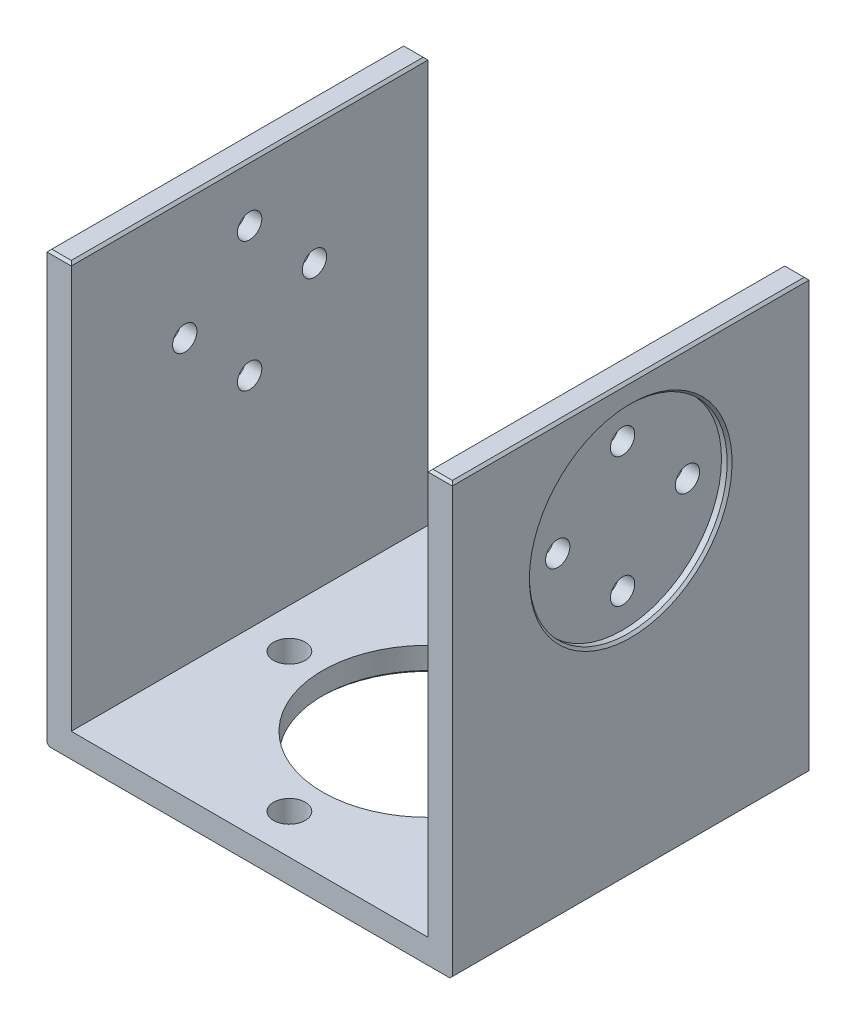
ISO-10303-21;
HEADER;
FILE_DESCRIPTION(('STEP AP214'),'2;1');
FILE_NAME('part.step','',(''),(''),'','','');
FILE_SCHEMA(('AUTOMOTIVE_DESIGN { 1 0 10303 214 1 1 1 1 }'));
ENDSEC;
DATA;
#1=APPLICATION_CONTEXT('core data for automotive mechanical design processes');
#2=APPLICATION_PROTOCOL_DEFINITION('international standard','automotive_design',2000,#1);
#3=PRODUCT_CONTEXT('',#1,'mechanical');
#4=PRODUCT('Part','Part','',(#3));
#5=PRODUCT_RELATED_PRODUCT_CATEGORY('part','',(#4));
#6=PRODUCT_DEFINITION_FORMATION('','',#4);
#7=PRODUCT_DEFINITION_CONTEXT('part definition',#1,'design');
#8=PRODUCT_DEFINITION('design','',#6,#7);
#9=PRODUCT_DEFINITION_SHAPE('','',#8);
#10=(LENGTH_UNIT() NAMED_UNIT(*) SI_UNIT(.MILLI.,.METRE.));
#11=(NAMED_UNIT(*) PLANE_ANGLE_UNIT() SI_UNIT($,.RADIAN.));
#12=(NAMED_UNIT(*) SI_UNIT($,.STERADIAN.) SOLID_ANGLE_UNIT());
#13=UNCERTAINTY_MEASURE_WITH_UNIT(LENGTH_MEASURE(1.E-05),#10,'distance_accuracy_value','');
#14=(GEOMETRIC_REPRESENTATION_CONTEXT(3) GLOBAL_UNCERTAINTY_ASSIGNED_CONTEXT((#13)) GLOBAL_UNIT_ASSIGNED_CONTEXT((#10,
#11,#12)) REPRESENTATION_CONTEXT('',''));
#15=CARTESIAN_POINT('',(0.,0.,0.));
#16=DIRECTION('',(0.,0.,1.));
#17=DIRECTION('',(1.,0.,0.));
#18=AXIS2_PLACEMENT_3D('',#15,#16,#17);
#19=CARTESIAN_POINT('',(25.,38.,-7.99999999999989));
#20=DIRECTION('',(-1.,0.,0.));
#21=DIRECTION('',(0.,0.,1.));
#22=AXIS2_PLACEMENT_3D('',#19,#20,#21);
#23=CYLINDRICAL_SURFACE('',#22,1.50000000000001);
#24=CARTESIAN_POINT('',(-22.,38.,-7.99999999999989));
#25=DIRECTION('',(-1.,0.,0.));
#26=DIRECTION('',(0.,0.,1.));
#27=AXIS2_PLACEMENT_3D('',#24,#25,#26);
#28=CIRCLE('',#27,1.50000000000001);
#29=CARTESIAN_POINT('',(-22.,38.,-6.49999999999988));
#30=VERTEX_POINT('',#29);
#31=EDGE_CURVE('E231',#30,#30,#28,.T.);
#32=ORIENTED_EDGE('',*,*,#31,.F.);
#33=EDGE_LOOP('',(#32));
#34=FACE_BOUND('',#33,.T.);
#35=CARTESIAN_POINT('',(-24.,38.,-7.99999999999989));
#36=DIRECTION('',(-1.,0.,0.));
#37=DIRECTION('',(0.,0.,1.));
#38=AXIS2_PLACEMENT_3D('',#35,#36,#37);
#39=CIRCLE('',#38,1.50000000000001);
#40=CARTESIAN_POINT('',(-24.,38.,-6.49999999999988));
#41=VERTEX_POINT('',#40);
#42=EDGE_CURVE('E452',#41,#41,#39,.F.);
#43=ORIENTED_EDGE('',*,*,#42,.F.);
#44=EDGE_LOOP('',(#43));
#45=FACE_BOUND('',#44,.T.);
#46=ADVANCED_FACE('F37',(#34,#45),#23,.F.);
#47=CARTESIAN_POINT('',(25.,30.,1.65619827587224E-13));
#48=DIRECTION('',(-1.,0.,0.));
#49=DIRECTION('',(0.,0.,1.));
#50=AXIS2_PLACEMENT_3D('',#47,#48,#49);
#51=CYLINDRICAL_SURFACE('',#50,1.5);
#52=CARTESIAN_POINT('',(-22.,30.,1.69325827740447E-13));
#53=DIRECTION('',(-1.,0.,0.));
#54=DIRECTION('',(0.,0.,1.));
#55=AXIS2_PLACEMENT_3D('',#52,#53,#54);
#56=CIRCLE('',#55,1.5);
#57=CARTESIAN_POINT('',(-22.,30.,1.50000000000017));
#58=VERTEX_POINT('',#57);
#59=EDGE_CURVE('E236',#58,#58,#56,.T.);
#60=ORIENTED_EDGE('',*,*,#59,.F.);
#61=EDGE_LOOP('',(#60));
#62=FACE_BOUND('',#61,.T.);
#63=CARTESIAN_POINT('',(-24.,30.,1.69483529874627E-13));
#64=DIRECTION('',(-1.,0.,0.));
#65=DIRECTION('',(0.,0.,1.));
#66=AXIS2_PLACEMENT_3D('',#63,#64,#65);
#67=CIRCLE('',#66,1.5);
#68=CARTESIAN_POINT('',(-24.,30.,1.50000000000017));
#69=VERTEX_POINT('',#68);
#70=EDGE_CURVE('E449',#69,#69,#67,.F.);
#71=ORIENTED_EDGE('',*,*,#70,.F.);
#72=EDGE_LOOP('',(#71));
#73=FACE_BOUND('',#72,.T.);
#74=ADVANCED_FACE('F400',(#62,#73),#51,.F.);
#75=CARTESIAN_POINT('',(25.,38.0000000000001,8.00000000000011));
#76=DIRECTION('',(-1.,0.,0.));
#77=DIRECTION('',(0.,0.,1.));
#78=AXIS2_PLACEMENT_3D('',#75,#76,#77);
#79=CYLINDRICAL_SURFACE('',#78,1.5);
#80=CARTESIAN_POINT('',(-22.,38.0000000000001,8.00000000000011));
#81=DIRECTION('',(-1.,0.,0.));
#82=DIRECTION('',(0.,0.,1.));
#83=AXIS2_PLACEMENT_3D('',#80,#81,#82);
#84=CIRCLE('',#83,1.5);
#85=CARTESIAN_POINT('',(-22.,38.0000000000001,9.50000000000012));
#86=VERTEX_POINT('',#85);
#87=EDGE_CURVE('E240',#86,#86,#84,.T.);
#88=ORIENTED_EDGE('',*,*,#87,.F.);
#89=EDGE_LOOP('',(#88));
#90=FACE_BOUND('',#89,.T.);
#91=CARTESIAN_POINT('',(-24.,38.0000000000001,8.00000000000011));
#92=DIRECTION('',(-1.,0.,0.));
#93=DIRECTION('',(0.,0.,1.));
#94=AXIS2_PLACEMENT_3D('',#91,#92,#93);
#95=CIRCLE('',#94,1.5);
#96=CARTESIAN_POINT('',(-24.,38.0000000000001,9.50000000000012));
#97=VERTEX_POINT('',#96);
#98=EDGE_CURVE('E251',#97,#97,#95,.F.);
#99=ORIENTED_EDGE('',*,*,#98,.F.);
#100=EDGE_LOOP('',(#99));
#101=FACE_BOUND('',#100,.T.);
#102=ADVANCED_FACE('F406',(#90,#101),#79,.F.);
#103=CARTESIAN_POINT('',(25.,46.,0.));
#104=DIRECTION('',(-1.,0.,0.));
#105=DIRECTION('',(0.,0.,1.));
#106=AXIS2_PLACEMENT_3D('',#103,#104,#105);
#107=CYLINDRICAL_SURFACE('',#106,1.5);
#108=CARTESIAN_POINT('',(-22.,46.,0.));
#109=DIRECTION('',(-1.,0.,0.));
#110=DIRECTION('',(0.,0.,1.));
#111=AXIS2_PLACEMENT_3D('',#108,#109,#110);
#112=CIRCLE('',#111,1.5);
#113=CARTESIAN_POINT('',(-22.,46.,1.5));
#114=VERTEX_POINT('',#113);
#115=EDGE_CURVE('E170',#114,#114,#112,.T.);
#116=ORIENTED_EDGE('',*,*,#115,.F.);
#117=EDGE_LOOP('',(#116));
#118=FACE_BOUND('',#117,.T.);
#119=CARTESIAN_POINT('',(-24.,46.,0.));
#120=DIRECTION('',(-1.,0.,0.));
#121=DIRECTION('',(0.,0.,1.));
#122=AXIS2_PLACEMENT_3D('',#119,#120,#121);
#123=CIRCLE('',#122,1.5);
#124=CARTESIAN_POINT('',(-24.,46.,1.5));
#125=VERTEX_POINT('',#124);
#126=EDGE_CURVE('E248',#125,#125,#123,.F.);
#127=ORIENTED_EDGE('',*,*,#126,.F.);
#128=EDGE_LOOP('',(#127));
#129=FACE_BOUND('',#128,.T.);
#130=ADVANCED_FACE('F413',(#118,#129),#107,.F.);
#131=CARTESIAN_POINT('',(22.,38.,-7.99999999999989));
#132=DIRECTION('',(1.,0.,0.));
#133=DIRECTION('',(0.,0.,-1.));
#134=AXIS2_PLACEMENT_3D('',#131,#132,#133);
#135=CIRCLE('',#134,1.50000000000001);
#136=CARTESIAN_POINT('',(22.,38.,-9.4999999999999));
#137=VERTEX_POINT('',#136);
#138=EDGE_CURVE('E228',#137,#137,#135,.T.);
#139=ORIENTED_EDGE('',*,*,#138,.F.);
#140=EDGE_LOOP('',(#139));
#141=FACE_BOUND('',#140,.T.);
#142=CARTESIAN_POINT('',(24.,38.,-7.99999999999989));
#143=DIRECTION('',(1.,0.,0.));
#144=DIRECTION('',(0.,0.,-1.));
#145=AXIS2_PLACEMENT_3D('',#142,#143,#144);
#146=CIRCLE('',#145,1.50000000000001);
#147=CARTESIAN_POINT('',(24.,38.,-9.4999999999999));
#148=VERTEX_POINT('',#147);
#149=EDGE_CURVE('E232',#148,#148,#146,.F.);
#150=ORIENTED_EDGE('',*,*,#149,.F.);
#151=EDGE_LOOP('',(#150));
#152=FACE_BOUND('',#151,.T.);
#153=ADVANCED_FACE('F402',(#141,#152),#23,.F.);
#154=CARTESIAN_POINT('',(22.,30.,1.65856380788494E-13));
#155=DIRECTION('',(1.,0.,0.));
#156=DIRECTION('',(0.,0.,-1.));
#157=AXIS2_PLACEMENT_3D('',#154,#155,#156);
#158=CIRCLE('',#157,1.5);
#159=CARTESIAN_POINT('',(22.,30.,-1.49999999999984));
#160=VERTEX_POINT('',#159);
#161=EDGE_CURVE('E233',#160,#160,#158,.T.);
#162=ORIENTED_EDGE('',*,*,#161,.F.);
#163=EDGE_LOOP('',(#162));
#164=FACE_BOUND('',#163,.T.);
#165=CARTESIAN_POINT('',(24.,30.,1.65698678654314E-13));
#166=DIRECTION('',(1.,0.,0.));
#167=DIRECTION('',(0.,0.,-1.));
#168=AXIS2_PLACEMENT_3D('',#165,#166,#167);
#169=CIRCLE('',#168,1.5);
#170=CARTESIAN_POINT('',(24.,30.,-1.49999999999984));
#171=VERTEX_POINT('',#170);
#172=EDGE_CURVE('E429',#171,#171,#169,.F.);
#173=ORIENTED_EDGE('',*,*,#172,.F.);
#174=EDGE_LOOP('',(#173));
#175=FACE_BOUND('',#174,.T.);
#176=ADVANCED_FACE('F409',(#164,#175),#51,.F.);
#177=CARTESIAN_POINT('',(22.,38.0000000000001,8.00000000000011));
#178=DIRECTION('',(1.,0.,0.));
#179=DIRECTION('',(0.,0.,-1.));
#180=AXIS2_PLACEMENT_3D('',#177,#178,#179);
#181=CIRCLE('',#180,1.5);
#182=CARTESIAN_POINT('',(22.,38.0000000000001,6.50000000000011));
#183=VERTEX_POINT('',#182);
#184=EDGE_CURVE('E237',#183,#183,#181,.T.);
#185=ORIENTED_EDGE('',*,*,#184,.F.);
#186=EDGE_LOOP('',(#185));
#187=FACE_BOUND('',#186,.T.);
#188=CARTESIAN_POINT('',(24.,38.0000000000001,8.00000000000011));
#189=DIRECTION('',(1.,0.,0.));
#190=DIRECTION('',(0.,0.,-1.));
#191=AXIS2_PLACEMENT_3D('',#188,#189,#190);
#192=CIRCLE('',#191,1.5);
#193=CARTESIAN_POINT('',(24.,38.0000000000001,6.50000000000011));
#194=VERTEX_POINT('',#193);
#195=EDGE_CURVE('E246',#194,#194,#192,.F.);
#196=ORIENTED_EDGE('',*,*,#195,.F.);
#197=EDGE_LOOP('',(#196));
#198=FACE_BOUND('',#197,.T.);
#199=ADVANCED_FACE('F419',(#187,#198),#79,.F.);
#200=CARTESIAN_POINT('',(22.,46.,0.));
#201=DIRECTION('',(1.,0.,0.));
#202=DIRECTION('',(0.,0.,-1.));
#203=AXIS2_PLACEMENT_3D('',#200,#201,#202);
#204=CIRCLE('',#203,1.5);
#205=CARTESIAN_POINT('',(22.,46.,-1.5));
#206=VERTEX_POINT('',#205);
#207=EDGE_CURVE('E174',#206,#206,#204,.T.);
#208=ORIENTED_EDGE('',*,*,#207,.F.);
#209=EDGE_LOOP('',(#208));
#210=FACE_BOUND('',#209,.T.);
#211=CARTESIAN_POINT('',(24.,46.,0.));
#212=DIRECTION('',(1.,0.,0.));
#213=DIRECTION('',(0.,0.,-1.));
#214=AXIS2_PLACEMENT_3D('',#211,#212,#213);
#215=CIRCLE('',#214,1.5);
#216=CARTESIAN_POINT('',(24.,46.,-1.5));
#217=VERTEX_POINT('',#216);
#218=EDGE_CURVE('E243',#217,#217,#215,.F.);
#219=ORIENTED_EDGE('',*,*,#218,.F.);
#220=EDGE_LOOP('',(#219));
#221=FACE_BOUND('',#220,.T.);
#222=ADVANCED_FACE('F423',(#210,#221),#107,.F.);
#223=CARTESIAN_POINT('',(0.,3.,0.));
#224=DIRECTION('',(0.,1.,0.));
#225=DIRECTION('',(0.,0.,1.));
#226=AXIS2_PLACEMENT_3D('',#223,#224,#225);
#227=PLANE('',#226);
#228=CARTESIAN_POINT('',(-17.0960910327302,3.,4.84853298069949E-13));
#229=DIRECTION('',(0.,1.,0.));
#230=DIRECTION('',(0.,0.,1.));
#231=AXIS2_PLACEMENT_3D('',#228,#229,#230);
#232=CIRCLE('',#231,1.95383897516999);
#233=CARTESIAN_POINT('',(-17.0960910327302,3.,1.95383897517048));
#234=VERTEX_POINT('',#233);
#235=EDGE_CURVE('E186',#234,#234,#232,.T.);
#236=ORIENTED_EDGE('',*,*,#235,.F.);
#237=EDGE_LOOP('',(#236));
#238=FACE_BOUND('',#237,.T.);
#239=CARTESIAN_POINT('',(17.0960910327312,3.,-4.82759630753832E-13));
#240=DIRECTION('',(0.,1.,0.));
#241=DIRECTION('',(0.,0.,1.));
#242=AXIS2_PLACEMENT_3D('',#239,#240,#241);
#243=CIRCLE('',#242,1.9538389751696);
#244=CARTESIAN_POINT('',(17.0960910327312,3.,1.95383897516911));
#245=VERTEX_POINT('',#244);
#246=EDGE_CURVE('E198',#245,#245,#243,.T.);
#247=ORIENTED_EDGE('',*,*,#246,.F.);
#248=EDGE_LOOP('',(#247));
#249=FACE_BOUND('',#248,.T.);
#250=CARTESIAN_POINT('',(0.,3.,-17.0960910327307));
#251=DIRECTION('',(0.,1.,0.));
#252=DIRECTION('',(0.,0.,1.));
#253=AXIS2_PLACEMENT_3D('',#250,#251,#252);
#254=CIRCLE('',#253,1.95383897516922);
#255=CARTESIAN_POINT('',(0.,3.,-15.1422520575615));
#256=VERTEX_POINT('',#255);
#257=EDGE_CURVE('E204',#256,#256,#254,.T.);
#258=ORIENTED_EDGE('',*,*,#257,.F.);
#259=EDGE_LOOP('',(#258));
#260=FACE_BOUND('',#259,.T.);
#261=CARTESIAN_POINT('',(9.65519261507664E-13,3.,17.0960910327307));
#262=DIRECTION('',(0.,1.,0.));
#263=DIRECTION('',(0.,0.,1.));
#264=AXIS2_PLACEMENT_3D('',#261,#262,#263);
#265=CIRCLE('',#264,1.95383897517026);
#266=CARTESIAN_POINT('',(9.65519261507664E-13,3.,19.0499300079009));
#267=VERTEX_POINT('',#266);
#268=EDGE_CURVE('E192',#267,#267,#265,.T.);
#269=ORIENTED_EDGE('',*,*,#268,.F.);
#270=EDGE_LOOP('',(#269));
#271=FACE_BOUND('',#270,.T.);
#272=CARTESIAN_POINT('',(0.,3.,0.));
#273=DIRECTION('',(0.,1.,0.));
#274=DIRECTION('',(0.,0.,1.));
#275=AXIS2_PLACEMENT_3D('',#272,#273,#274);
#276=CIRCLE('',#275,13.);
#277=CARTESIAN_POINT('',(0.,3.,13.));
#278=VERTEX_POINT('',#277);
#279=EDGE_CURVE('E182',#278,#278,#276,.T.);
#280=ORIENTED_EDGE('',*,*,#279,.F.);
#281=EDGE_LOOP('',(#280));
#282=FACE_BOUND('',#281,.T.);
#283=DIRECTION('',(1.,0.,0.));
#284=VECTOR('',#283,1.);
#285=CARTESIAN_POINT('',(-25.,3.,22.));
#286=LINE('',#285,#284);
#287=CARTESIAN_POINT('',(-22.,3.,22.));
#288=VERTEX_POINT('',#287);
#289=CARTESIAN_POINT('',(22.,3.,22.));
#290=VERTEX_POINT('',#289);
#291=EDGE_CURVE('E165',#288,#290,#286,.T.);
#292=ORIENTED_EDGE('',*,*,#291,.T.);
#293=DIRECTION('',(0.,0.,1.));
#294=VECTOR('',#293,1.);
#295=CARTESIAN_POINT('',(22.,3.,-22.));
#296=LINE('',#295,#294);
#297=CARTESIAN_POINT('',(22.,3.,-22.));
#298=VERTEX_POINT('',#297);
#299=EDGE_CURVE('E146',#298,#290,#296,.T.);
#300=ORIENTED_EDGE('',*,*,#299,.F.);
#301=DIRECTION('',(-1.,0.,0.));
#302=VECTOR('',#301,1.);
#303=CARTESIAN_POINT('',(-25.,3.,-22.));
#304=LINE('',#303,#302);
#305=CARTESIAN_POINT('',(-22.,3.,-22.));
#306=VERTEX_POINT('',#305);
#307=EDGE_CURVE('E155',#298,#306,#304,.T.);
#308=ORIENTED_EDGE('',*,*,#307,.T.);
#309=DIRECTION('',(0.,0.,-1.));
#310=VECTOR('',#309,1.);
#311=CARTESIAN_POINT('',(-22.,3.,-22.));
#312=LINE('',#311,#310);
#313=EDGE_CURVE('E151',#288,#306,#312,.T.);
#314=ORIENTED_EDGE('',*,*,#313,.F.);
#315=EDGE_LOOP('',(#292,#300,#308,#314));
#316=FACE_BOUND('',#315,.T.);
#317=ADVANCED_FACE('F168',(#238,#249,#260,#271,#282,#316),#227,.T.);
#318=CARTESIAN_POINT('',(0.,0.,0.));
#319=DIRECTION('',(0.,1.,0.));
#320=DIRECTION('',(0.,0.,1.));
#321=AXIS2_PLACEMENT_3D('',#318,#319,#320);
#322=PLANE('',#321);
#323=CARTESIAN_POINT('',(0.,0.,0.));
#324=DIRECTION('',(0.,1.,0.));
#325=DIRECTION('',(0.,0.,1.));
#326=AXIS2_PLACEMENT_3D('',#323,#324,#325);
#327=CIRCLE('',#326,13.3);
#328=CARTESIAN_POINT('',(0.,0.,13.3));
#329=VERTEX_POINT('',#328);
#330=EDGE_CURVE('E307',#329,#329,#327,.T.);
#331=ORIENTED_EDGE('',*,*,#330,.T.);
#332=EDGE_LOOP('',(#331));
#333=FACE_BOUND('',#332,.T.);
#334=DIRECTION('',(1.,0.,0.));
#335=VECTOR('',#334,1.);
#336=CARTESIAN_POINT('',(-25.,0.,22.));
#337=LINE('',#336,#335);
#338=CARTESIAN_POINT('',(-24.7,0.,22.));
#339=VERTEX_POINT('',#338);
#340=CARTESIAN_POINT('',(24.7,0.,22.));
#341=VERTEX_POINT('',#340);
#342=EDGE_CURVE('E207',#339,#341,#337,.T.);
#343=ORIENTED_EDGE('',*,*,#342,.F.);
#344=DIRECTION('',(0.,0.,-1.));
#345=VECTOR('',#344,1.);
#346=CARTESIAN_POINT('',(-24.7,0.,0.));
#347=LINE('',#346,#345);
#348=CARTESIAN_POINT('',(-24.7,0.,-22.));
#349=VERTEX_POINT('',#348);
#350=EDGE_CURVE('E305',#339,#349,#347,.T.);
#351=ORIENTED_EDGE('',*,*,#350,.T.);
#352=DIRECTION('',(-1.,0.,0.));
#353=VECTOR('',#352,1.);
#354=CARTESIAN_POINT('',(-25.,0.,-22.));
#355=LINE('',#354,#353);
#356=CARTESIAN_POINT('',(24.7,0.,-22.));
#357=VERTEX_POINT('',#356);
#358=EDGE_CURVE('E210',#357,#349,#355,.T.);
#359=ORIENTED_EDGE('',*,*,#358,.F.);
#360=DIRECTION('',(0.,0.,1.));
#361=VECTOR('',#360,1.);
#362=CARTESIAN_POINT('',(24.7,0.,0.));
#363=LINE('',#362,#361);
#364=EDGE_CURVE('E303',#357,#341,#363,.T.);
#365=ORIENTED_EDGE('',*,*,#364,.T.);
#366=EDGE_LOOP('',(#343,#351,#359,#365));
#367=FACE_BOUND('',#366,.T.);
#368=CARTESIAN_POINT('',(0.,0.,-17.0960910327307));
#369=DIRECTION('',(0.,1.,0.));
#370=DIRECTION('',(0.,0.,1.));
#371=AXIS2_PLACEMENT_3D('',#368,#369,#370);
#372=CIRCLE('',#371,1.95383897516922);
#373=CARTESIAN_POINT('',(0.,0.,-15.1422520575615));
#374=VERTEX_POINT('',#373);
#375=EDGE_CURVE('E201',#374,#374,#372,.T.);
#376=ORIENTED_EDGE('',*,*,#375,.T.);
#377=EDGE_LOOP('',(#376));
#378=FACE_BOUND('',#377,.T.);
#379=CARTESIAN_POINT('',(17.0960910327312,0.,-4.82759630753832E-13));
#380=DIRECTION('',(0.,1.,0.));
#381=DIRECTION('',(0.,0.,1.));
#382=AXIS2_PLACEMENT_3D('',#379,#380,#381);
#383=CIRCLE('',#382,1.9538389751696);
#384=CARTESIAN_POINT('',(17.0960910327312,0.,1.95383897516911));
#385=VERTEX_POINT('',#384);
#386=EDGE_CURVE('E195',#385,#385,#383,.T.);
#387=ORIENTED_EDGE('',*,*,#386,.T.);
#388=EDGE_LOOP('',(#387));
#389=FACE_BOUND('',#388,.T.);
#390=CARTESIAN_POINT('',(9.65519261507664E-13,0.,17.0960910327307));
#391=DIRECTION('',(0.,1.,0.));
#392=DIRECTION('',(0.,0.,1.));
#393=AXIS2_PLACEMENT_3D('',#390,#391,#392);
#394=CIRCLE('',#393,1.95383897517026);
#395=CARTESIAN_POINT('',(9.65519261507664E-13,0.,19.0499300079009));
#396=VERTEX_POINT('',#395);
#397=EDGE_CURVE('E189',#396,#396,#394,.T.);
#398=ORIENTED_EDGE('',*,*,#397,.T.);
#399=EDGE_LOOP('',(#398));
#400=FACE_BOUND('',#399,.T.);
#401=CARTESIAN_POINT('',(-17.0960910327302,0.,4.84853298069949E-13));
#402=DIRECTION('',(0.,1.,0.));
#403=DIRECTION('',(0.,0.,1.));
#404=AXIS2_PLACEMENT_3D('',#401,#402,#403);
#405=CIRCLE('',#404,1.95383897516999);
#406=CARTESIAN_POINT('',(-17.0960910327302,0.,1.95383897517048));
#407=VERTEX_POINT('',#406);
#408=EDGE_CURVE('E185',#407,#407,#405,.T.);
#409=ORIENTED_EDGE('',*,*,#408,.T.);
#410=EDGE_LOOP('',(#409));
#411=FACE_BOUND('',#410,.T.);
#412=ADVANCED_FACE('F351',(#333,#367,#378,#389,#400,#411),#322,.F.);
#413=CARTESIAN_POINT('',(-25.,3.,-22.));
#414=DIRECTION('',(1.,0.,0.));
#415=DIRECTION('',(0.,0.,-1.));
#416=AXIS2_PLACEMENT_3D('',#413,#414,#415);
#417=PLANE('',#416);
#418=CARTESIAN_POINT('',(-25.,38.,0.));
#419=DIRECTION('',(1.,0.,0.));
#420=DIRECTION('',(0.,0.,-1.));
#421=AXIS2_PLACEMENT_3D('',#418,#419,#420);
#422=CIRCLE('',#421,12.5);
#423=CARTESIAN_POINT('',(-25.,38.,-12.4999999999999));
#424=VERTEX_POINT('',#423);
#425=EDGE_CURVE('E283',#424,#424,#422,.T.);
#426=ORIENTED_EDGE('',*,*,#425,.T.);
#427=EDGE_LOOP('',(#426));
#428=FACE_BOUND('',#427,.T.);
#429=DIRECTION('',(0.,-1.,0.));
#430=VECTOR('',#429,1.);
#431=CARTESIAN_POINT('',(-25.,3.,22.));
#432=LINE('',#431,#430);
#433=CARTESIAN_POINT('',(-25.,52.7,22.));
#434=VERTEX_POINT('',#433);
#435=CARTESIAN_POINT('',(-25.,0.300000000000002,22.));
#436=VERTEX_POINT('',#435);
#437=EDGE_CURVE('E224',#434,#436,#432,.T.);
#438=ORIENTED_EDGE('',*,*,#437,.F.);
#439=DIRECTION('',(0.,0.,-1.));
#440=VECTOR('',#439,1.);
#441=CARTESIAN_POINT('',(-25.,52.7,-22.));
#442=LINE('',#441,#440);
#443=CARTESIAN_POINT('',(-25.,52.7,-22.));
#444=VERTEX_POINT('',#443);
#445=EDGE_CURVE('E286',#434,#444,#442,.T.);
#446=ORIENTED_EDGE('',*,*,#445,.T.);
#447=DIRECTION('',(0.,-1.,0.));
#448=VECTOR('',#447,1.);
#449=CARTESIAN_POINT('',(-25.,3.,-22.));
#450=LINE('',#449,#448);
#451=CARTESIAN_POINT('',(-25.,0.300000000000002,-22.));
#452=VERTEX_POINT('',#451);
#453=EDGE_CURVE('E164',#444,#452,#450,.T.);
#454=ORIENTED_EDGE('',*,*,#453,.T.);
#455=DIRECTION('',(0.,0.,1.));
#456=VECTOR('',#455,1.);
#457=CARTESIAN_POINT('',(-25.,0.300000000000002,-22.));
#458=LINE('',#457,#456);
#459=EDGE_CURVE('E280',#452,#436,#458,.T.);
#460=ORIENTED_EDGE('',*,*,#459,.T.);
#461=EDGE_LOOP('',(#438,#446,#454,#460));
#462=FACE_BOUND('',#461,.T.);
#463=ADVANCED_FACE('F360',(#428,#462),#417,.F.);
#464=CARTESIAN_POINT('',(-25.,3.,22.));
#465=DIRECTION('',(0.,0.,-1.));
#466=DIRECTION('',(-1.,0.,0.));
#467=AXIS2_PLACEMENT_3D('',#464,#465,#466);
#468=PLANE('',#467);
#469=DIRECTION('',(0.,-1.,0.));
#470=VECTOR('',#469,1.);
#471=CARTESIAN_POINT('',(-22.,53.,22.));
#472=LINE('',#471,#470);
#473=CARTESIAN_POINT('',(-22.,52.7,22.));
#474=VERTEX_POINT('',#473);
#475=EDGE_CURVE('E180',#474,#288,#472,.T.);
#476=ORIENTED_EDGE('',*,*,#475,.F.);
#477=DIRECTION('',(-1.,0.,0.));
#478=VECTOR('',#477,1.);
#479=CARTESIAN_POINT('',(-25.,52.7,22.));
#480=LINE('',#479,#478);
#481=EDGE_CURVE('E278',#474,#434,#480,.T.);
#482=ORIENTED_EDGE('',*,*,#481,.T.);
#483=ORIENTED_EDGE('',*,*,#437,.T.);
#484=DIRECTION('',(-0.707106781186558,0.707106781186537,0.));
#485=VECTOR('',#484,1.);
#486=CARTESIAN_POINT('',(-25.,0.300000000000003,22.));
#487=LINE('',#486,#485);
#488=EDGE_CURVE('E273',#436,#339,#487,.F.);
#489=ORIENTED_EDGE('',*,*,#488,.T.);
#490=ORIENTED_EDGE('',*,*,#342,.T.);
#491=DIRECTION('',(-0.707106781186558,-0.707106781186537,0.));
#492=VECTOR('',#491,1.);
#493=CARTESIAN_POINT('',(25.,0.299999999999996,22.));
#494=LINE('',#493,#492);
#495=CARTESIAN_POINT('',(25.,0.300000000000002,22.));
#496=VERTEX_POINT('',#495);
#497=EDGE_CURVE('E271',#341,#496,#494,.F.);
#498=ORIENTED_EDGE('',*,*,#497,.T.);
#499=DIRECTION('',(0.,-1.,0.));
#500=VECTOR('',#499,1.);
#501=CARTESIAN_POINT('',(25.,3.,22.));
#502=LINE('',#501,#500);
#503=CARTESIAN_POINT('',(25.,52.7,22.));
#504=VERTEX_POINT('',#503);
#505=EDGE_CURVE('E221',#504,#496,#502,.T.);
#506=ORIENTED_EDGE('',*,*,#505,.F.);
#507=DIRECTION('',(-1.,0.,0.));
#508=VECTOR('',#507,1.);
#509=CARTESIAN_POINT('',(-25.,52.7,22.));
#510=LINE('',#509,#508);
#511=CARTESIAN_POINT('',(22.,52.7,22.));
#512=VERTEX_POINT('',#511);
#513=EDGE_CURVE('E275',#504,#512,#510,.T.);
#514=ORIENTED_EDGE('',*,*,#513,.T.);
#515=DIRECTION('',(0.,-1.,0.));
#516=VECTOR('',#515,1.);
#517=CARTESIAN_POINT('',(22.,53.,22.));
#518=LINE('',#517,#516);
#519=EDGE_CURVE('E152',#512,#290,#518,.T.);
#520=ORIENTED_EDGE('',*,*,#519,.T.);
#521=ORIENTED_EDGE('',*,*,#291,.F.);
#522=EDGE_LOOP('',(#476,#482,#483,#489,#490,#498,#506,#514,#520,#521));
#523=FACE_BOUND('',#522,.T.);
#524=ADVANCED_FACE('F376',(#523),#468,.F.);
#525=CARTESIAN_POINT('',(25.,3.,-22.));
#526=DIRECTION('',(-1.,0.,0.));
#527=DIRECTION('',(0.,0.,1.));
#528=AXIS2_PLACEMENT_3D('',#525,#526,#527);
#529=PLANE('',#528);
#530=CARTESIAN_POINT('',(25.,38.,0.));
#531=DIRECTION('',(-1.,0.,0.));
#532=DIRECTION('',(0.,0.,1.));
#533=AXIS2_PLACEMENT_3D('',#530,#531,#532);
#534=CIRCLE('',#533,12.5);
#535=CARTESIAN_POINT('',(25.,38.,12.5000000000001));
#536=VERTEX_POINT('',#535);
#537=EDGE_CURVE('E298',#536,#536,#534,.T.);
#538=ORIENTED_EDGE('',*,*,#537,.T.);
#539=EDGE_LOOP('',(#538));
#540=FACE_BOUND('',#539,.T.);
#541=DIRECTION('',(0.,-1.,0.));
#542=VECTOR('',#541,1.);
#543=CARTESIAN_POINT('',(25.,3.,-22.));
#544=LINE('',#543,#542);
#545=CARTESIAN_POINT('',(25.,52.7,-22.));
#546=VERTEX_POINT('',#545);
#547=CARTESIAN_POINT('',(25.,0.300000000000002,-22.));
#548=VERTEX_POINT('',#547);
#549=EDGE_CURVE('E218',#546,#548,#544,.T.);
#550=ORIENTED_EDGE('',*,*,#549,.F.);
#551=DIRECTION('',(0.,0.,1.));
#552=VECTOR('',#551,1.);
#553=CARTESIAN_POINT('',(25.,52.7,-22.));
#554=LINE('',#553,#552);
#555=EDGE_CURVE('E301',#546,#504,#554,.T.);
#556=ORIENTED_EDGE('',*,*,#555,.T.);
#557=ORIENTED_EDGE('',*,*,#505,.T.);
#558=DIRECTION('',(0.,0.,-1.));
#559=VECTOR('',#558,1.);
#560=CARTESIAN_POINT('',(25.,0.300000000000002,-22.));
#561=LINE('',#560,#559);
#562=EDGE_CURVE('E295',#496,#548,#561,.T.);
#563=ORIENTED_EDGE('',*,*,#562,.T.);
#564=EDGE_LOOP('',(#550,#556,#557,#563));
#565=FACE_BOUND('',#564,.T.);
#566=ADVANCED_FACE('F341',(#540,#565),#529,.F.);
#567=CARTESIAN_POINT('',(-25.,3.,-22.));
#568=DIRECTION('',(0.,0.,1.));
#569=DIRECTION('',(1.,0.,0.));
#570=AXIS2_PLACEMENT_3D('',#567,#568,#569);
#571=PLANE('',#570);
#572=ORIENTED_EDGE('',*,*,#453,.F.);
#573=DIRECTION('',(1.,0.,0.));
#574=VECTOR('',#573,1.);
#575=CARTESIAN_POINT('',(-22.,52.7,-22.));
#576=LINE('',#575,#574);
#577=CARTESIAN_POINT('',(-22.,52.7,-22.));
#578=VERTEX_POINT('',#577);
#579=EDGE_CURVE('E267',#444,#578,#576,.T.);
#580=ORIENTED_EDGE('',*,*,#579,.T.);
#581=DIRECTION('',(0.,-1.,0.));
#582=VECTOR('',#581,1.);
#583=CARTESIAN_POINT('',(-22.,53.,-22.));
#584=LINE('',#583,#582);
#585=EDGE_CURVE('E160',#578,#306,#584,.T.);
#586=ORIENTED_EDGE('',*,*,#585,.T.);
#587=ORIENTED_EDGE('',*,*,#307,.F.);
#588=DIRECTION('',(0.,-1.,0.));
#589=VECTOR('',#588,1.);
#590=CARTESIAN_POINT('',(22.,53.,-22.));
#591=LINE('',#590,#589);
#592=CARTESIAN_POINT('',(22.,52.7,-22.));
#593=VERTEX_POINT('',#592);
#594=EDGE_CURVE('E141',#593,#298,#591,.T.);
#595=ORIENTED_EDGE('',*,*,#594,.F.);
#596=DIRECTION('',(1.,0.,0.));
#597=VECTOR('',#596,1.);
#598=CARTESIAN_POINT('',(-25.,52.7,-22.));
#599=LINE('',#598,#597);
#600=EDGE_CURVE('E265',#593,#546,#599,.T.);
#601=ORIENTED_EDGE('',*,*,#600,.T.);
#602=ORIENTED_EDGE('',*,*,#549,.T.);
#603=DIRECTION('',(0.707106781186558,0.707106781186537,0.));
#604=VECTOR('',#603,1.);
#605=CARTESIAN_POINT('',(25.,0.300000000000002,-22.));
#606=LINE('',#605,#604);
#607=EDGE_CURVE('E261',#548,#357,#606,.F.);
#608=ORIENTED_EDGE('',*,*,#607,.T.);
#609=ORIENTED_EDGE('',*,*,#358,.T.);
#610=DIRECTION('',(0.707106781186558,-0.707106781186537,0.));
#611=VECTOR('',#610,1.);
#612=CARTESIAN_POINT('',(-25.,0.300000000000002,-22.));
#613=LINE('',#612,#611);
#614=EDGE_CURVE('E263',#349,#452,#613,.F.);
#615=ORIENTED_EDGE('',*,*,#614,.T.);
#616=EDGE_LOOP('',(#572,#580,#586,#587,#595,#601,#602,#608,#609,#615));
#617=FACE_BOUND('',#616,.T.);
#618=ADVANCED_FACE('F157',(#617),#571,.F.);
#619=CARTESIAN_POINT('',(0.,3.,-17.0960910327307));
#620=DIRECTION('',(0.,-1.,0.));
#621=DIRECTION('',(0.,0.,-1.));
#622=AXIS2_PLACEMENT_3D('',#619,#620,#621);
#623=CYLINDRICAL_SURFACE('',#622,1.95383897516922);
#624=ORIENTED_EDGE('',*,*,#257,.T.);
#625=EDGE_LOOP('',(#624));
#626=FACE_BOUND('',#625,.T.);
#627=ORIENTED_EDGE('',*,*,#375,.F.);
#628=EDGE_LOOP('',(#627));
#629=FACE_BOUND('',#628,.T.);
#630=ADVANCED_FACE('F700',(#626,#629),#623,.F.);
#631=CARTESIAN_POINT('',(17.0960910327312,3.,-4.82759630753832E-13));
#632=DIRECTION('',(0.,-1.,0.));
#633=DIRECTION('',(0.,0.,-1.));
#634=AXIS2_PLACEMENT_3D('',#631,#632,#633);
#635=CYLINDRICAL_SURFACE('',#634,1.9538389751696);
#636=ORIENTED_EDGE('',*,*,#246,.T.);
#637=EDGE_LOOP('',(#636));
#638=FACE_BOUND('',#637,.T.);
#639=ORIENTED_EDGE('',*,*,#386,.F.);
#640=EDGE_LOOP('',(#639));
#641=FACE_BOUND('',#640,.T.);
#642=ADVANCED_FACE('F738',(#638,#641),#635,.F.);
#643=CARTESIAN_POINT('',(9.65519261507664E-13,3.,17.0960910327307));
#644=DIRECTION('',(0.,-1.,0.));
#645=DIRECTION('',(0.,0.,-1.));
#646=AXIS2_PLACEMENT_3D('',#643,#644,#645);
#647=CYLINDRICAL_SURFACE('',#646,1.95383897517026);
#648=ORIENTED_EDGE('',*,*,#268,.T.);
#649=EDGE_LOOP('',(#648));
#650=FACE_BOUND('',#649,.T.);
#651=ORIENTED_EDGE('',*,*,#397,.F.);
#652=EDGE_LOOP('',(#651));
#653=FACE_BOUND('',#652,.T.);
#654=ADVANCED_FACE('F731',(#650,#653),#647,.F.);
#655=CARTESIAN_POINT('',(-17.0960910327302,3.,4.84853298069949E-13));
#656=DIRECTION('',(0.,-1.,0.));
#657=DIRECTION('',(0.,0.,-1.));
#658=AXIS2_PLACEMENT_3D('',#655,#656,#657);
#659=CYLINDRICAL_SURFACE('',#658,1.95383897516999);
#660=ORIENTED_EDGE('',*,*,#235,.T.);
#661=EDGE_LOOP('',(#660));
#662=FACE_BOUND('',#661,.T.);
#663=ORIENTED_EDGE('',*,*,#408,.F.);
#664=EDGE_LOOP('',(#663));
#665=FACE_BOUND('',#664,.T.);
#666=ADVANCED_FACE('F716',(#662,#665),#659,.F.);
#667=CARTESIAN_POINT('',(0.,3.,0.));
#668=DIRECTION('',(0.,-1.,0.));
#669=DIRECTION('',(0.,0.,-1.));
#670=AXIS2_PLACEMENT_3D('',#667,#668,#669);
#671=CYLINDRICAL_SURFACE('',#670,13.);
#672=CARTESIAN_POINT('',(0.,0.300000000000009,0.));
#673=DIRECTION('',(0.,1.,0.));
#674=DIRECTION('',(0.,0.,1.));
#675=AXIS2_PLACEMENT_3D('',#672,#673,#674);
#676=CIRCLE('',#675,13.);
#677=CARTESIAN_POINT('',(0.,0.300000000000009,13.));
#678=VERTEX_POINT('',#677);
#679=EDGE_CURVE('E310',#678,#678,#676,.F.);
#680=ORIENTED_EDGE('',*,*,#679,.T.);
#681=EDGE_LOOP('',(#680));
#682=FACE_BOUND('',#681,.T.);
#683=ORIENTED_EDGE('',*,*,#279,.T.);
#684=EDGE_LOOP('',(#683));
#685=FACE_BOUND('',#684,.T.);
#686=ADVANCED_FACE('F690',(#682,#685),#671,.F.);
#687=CARTESIAN_POINT('',(-22.,53.,-22.));
#688=DIRECTION('',(-1.,0.,0.));
#689=DIRECTION('',(0.,0.,1.));
#690=AXIS2_PLACEMENT_3D('',#687,#688,#689);
#691=PLANE('',#690);
#692=ORIENTED_EDGE('',*,*,#115,.T.);
#693=EDGE_LOOP('',(#692));
#694=FACE_BOUND('',#693,.T.);
#695=ORIENTED_EDGE('',*,*,#87,.T.);
#696=EDGE_LOOP('',(#695));
#697=FACE_BOUND('',#696,.T.);
#698=ORIENTED_EDGE('',*,*,#59,.T.);
#699=EDGE_LOOP('',(#698));
#700=FACE_BOUND('',#699,.T.);
#701=ORIENTED_EDGE('',*,*,#31,.T.);
#702=EDGE_LOOP('',(#701));
#703=FACE_BOUND('',#702,.T.);
#704=ORIENTED_EDGE('',*,*,#585,.F.);
#705=DIRECTION('',(0.,0.,1.));
#706=VECTOR('',#705,1.);
#707=CARTESIAN_POINT('',(-22.,52.7,22.));
#708=LINE('',#707,#706);
#709=EDGE_CURVE('E269',#578,#474,#708,.T.);
#710=ORIENTED_EDGE('',*,*,#709,.T.);
#711=ORIENTED_EDGE('',*,*,#475,.T.);
#712=ORIENTED_EDGE('',*,*,#313,.T.);
#713=EDGE_LOOP('',(#704,#710,#711,#712));
#714=FACE_BOUND('',#713,.T.);
#715=ADVANCED_FACE('F373',(#694,#697,#700,#703,#714),#691,.F.);
#716=CARTESIAN_POINT('',(0.,53.,0.));
#717=DIRECTION('',(0.,1.,0.));
#718=DIRECTION('',(0.,0.,1.));
#719=AXIS2_PLACEMENT_3D('',#716,#717,#718);
#720=PLANE('',#719);
#721=DIRECTION('',(0.,0.,-1.));
#722=VECTOR('',#721,1.);
#723=CARTESIAN_POINT('',(-22.3,53.,-22.));
#724=LINE('',#723,#722);
#725=CARTESIAN_POINT('',(-22.3,53.,21.7));
#726=VERTEX_POINT('',#725);
#727=CARTESIAN_POINT('',(-22.3,53.,-21.7));
#728=VERTEX_POINT('',#727);
#729=EDGE_CURVE('E256',#726,#728,#724,.T.);
#730=ORIENTED_EDGE('',*,*,#729,.T.);
#731=DIRECTION('',(-1.,0.,0.));
#732=VECTOR('',#731,1.);
#733=CARTESIAN_POINT('',(-25.,53.,-21.7));
#734=LINE('',#733,#732);
#735=CARTESIAN_POINT('',(-24.7,53.,-21.7));
#736=VERTEX_POINT('',#735);
#737=EDGE_CURVE('E258',#728,#736,#734,.T.);
#738=ORIENTED_EDGE('',*,*,#737,.T.);
#739=DIRECTION('',(0.,0.,1.));
#740=VECTOR('',#739,1.);
#741=CARTESIAN_POINT('',(-24.7,53.,22.));
#742=LINE('',#741,#740);
#743=CARTESIAN_POINT('',(-24.7,53.,21.7));
#744=VERTEX_POINT('',#743);
#745=EDGE_CURVE('E227',#736,#744,#742,.T.);
#746=ORIENTED_EDGE('',*,*,#745,.T.);
#747=DIRECTION('',(1.,0.,0.));
#748=VECTOR('',#747,1.);
#749=CARTESIAN_POINT('',(-22.,53.,21.7));
#750=LINE('',#749,#748);
#751=EDGE_CURVE('E254',#744,#726,#750,.T.);
#752=ORIENTED_EDGE('',*,*,#751,.T.);
#753=EDGE_LOOP('',(#730,#738,#746,#752));
#754=FACE_BOUND('',#753,.T.);
#755=ADVANCED_FACE('F395',(#754),#720,.T.);
#756=CARTESIAN_POINT('',(22.,53.,-22.));
#757=DIRECTION('',(1.,0.,0.));
#758=DIRECTION('',(0.,0.,-1.));
#759=AXIS2_PLACEMENT_3D('',#756,#757,#758);
#760=PLANE('',#759);
#761=ORIENTED_EDGE('',*,*,#207,.T.);
#762=EDGE_LOOP('',(#761));
#763=FACE_BOUND('',#762,.T.);
#764=ORIENTED_EDGE('',*,*,#184,.T.);
#765=EDGE_LOOP('',(#764));
#766=FACE_BOUND('',#765,.T.);
#767=ORIENTED_EDGE('',*,*,#161,.T.);
#768=EDGE_LOOP('',(#767));
#769=FACE_BOUND('',#768,.T.);
#770=ORIENTED_EDGE('',*,*,#138,.T.);
#771=EDGE_LOOP('',(#770));
#772=FACE_BOUND('',#771,.T.);
#773=ORIENTED_EDGE('',*,*,#519,.F.);
#774=DIRECTION('',(0.,0.,-1.));
#775=VECTOR('',#774,1.);
#776=CARTESIAN_POINT('',(22.,52.7,-22.));
#777=LINE('',#776,#775);
#778=EDGE_CURVE('E148',#512,#593,#777,.T.);
#779=ORIENTED_EDGE('',*,*,#778,.T.);
#780=ORIENTED_EDGE('',*,*,#594,.T.);
#781=ORIENTED_EDGE('',*,*,#299,.T.);
#782=EDGE_LOOP('',(#773,#779,#780,#781));
#783=FACE_BOUND('',#782,.T.);
#784=ADVANCED_FACE('F144',(#763,#766,#769,#772,#783),#760,.F.);
#785=CARTESIAN_POINT('',(0.,53.,0.));
#786=DIRECTION('',(0.,-1.,0.));
#787=DIRECTION('',(0.,0.,-1.));
#788=AXIS2_PLACEMENT_3D('',#785,#786,#787);
#789=PLANE('',#788);
#790=DIRECTION('',(0.,0.,1.));
#791=VECTOR('',#790,1.);
#792=CARTESIAN_POINT('',(22.3,53.,0.));
#793=LINE('',#792,#791);
#794=CARTESIAN_POINT('',(22.3,53.,-21.7));
#795=VERTEX_POINT('',#794);
#796=CARTESIAN_POINT('',(22.3,53.,21.7));
#797=VERTEX_POINT('',#796);
#798=EDGE_CURVE('E55',#795,#797,#793,.T.);
#799=ORIENTED_EDGE('',*,*,#798,.T.);
#800=DIRECTION('',(1.,0.,0.));
#801=VECTOR('',#800,1.);
#802=CARTESIAN_POINT('',(0.,53.,21.7));
#803=LINE('',#802,#801);
#804=CARTESIAN_POINT('',(24.7,53.,21.7));
#805=VERTEX_POINT('',#804);
#806=EDGE_CURVE('E292',#797,#805,#803,.T.);
#807=ORIENTED_EDGE('',*,*,#806,.T.);
#808=DIRECTION('',(0.,0.,-1.));
#809=VECTOR('',#808,1.);
#810=CARTESIAN_POINT('',(24.7,53.,0.));
#811=LINE('',#810,#809);
#812=CARTESIAN_POINT('',(24.7,53.,-21.7));
#813=VERTEX_POINT('',#812);
#814=EDGE_CURVE('E288',#805,#813,#811,.T.);
#815=ORIENTED_EDGE('',*,*,#814,.T.);
#816=DIRECTION('',(-1.,0.,0.));
#817=VECTOR('',#816,1.);
#818=CARTESIAN_POINT('',(0.,53.,-21.7));
#819=LINE('',#818,#817);
#820=EDGE_CURVE('E60',#813,#795,#819,.T.);
#821=ORIENTED_EDGE('',*,*,#820,.T.);
#822=EDGE_LOOP('',(#799,#807,#815,#821));
#823=FACE_BOUND('',#822,.T.);
#824=ADVANCED_FACE('F384',(#823),#789,.F.);
#825=CARTESIAN_POINT('',(24.,38.,0.));
#826=DIRECTION('',(1.,0.,0.));
#827=DIRECTION('',(0.,0.,-1.));
#828=AXIS2_PLACEMENT_3D('',#825,#826,#827);
#829=PLANE('',#828);
#830=CARTESIAN_POINT('',(24.,38.,0.));
#831=DIRECTION('',(1.,0.,0.));
#832=DIRECTION('',(0.,0.,-1.));
#833=AXIS2_PLACEMENT_3D('',#830,#831,#832);
#834=CIRCLE('',#833,12.2);
#835=CARTESIAN_POINT('',(24.,38.,-12.1999999999999));
#836=VERTEX_POINT('',#835);
#837=EDGE_CURVE('E247',#836,#836,#834,.T.);
#838=ORIENTED_EDGE('',*,*,#837,.T.);
#839=EDGE_LOOP('',(#838));
#840=FACE_BOUND('',#839,.T.);
#841=ORIENTED_EDGE('',*,*,#218,.T.);
#842=EDGE_LOOP('',(#841));
#843=FACE_BOUND('',#842,.T.);
#844=ORIENTED_EDGE('',*,*,#195,.T.);
#845=EDGE_LOOP('',(#844));
#846=FACE_BOUND('',#845,.T.);
#847=ORIENTED_EDGE('',*,*,#172,.T.);
#848=EDGE_LOOP('',(#847));
#849=FACE_BOUND('',#848,.T.);
#850=ORIENTED_EDGE('',*,*,#149,.T.);
#851=EDGE_LOOP('',(#850));
#852=FACE_BOUND('',#851,.T.);
#853=ADVANCED_FACE('F386',(#840,#843,#846,#849,#852),#829,.T.);
#854=CARTESIAN_POINT('',(24.,38.,0.));
#855=DIRECTION('',(1.,0.,0.));
#856=DIRECTION('',(0.,0.,-1.));
#857=AXIS2_PLACEMENT_3D('',#854,#855,#856);
#858=CYLINDRICAL_SURFACE('',#857,12.2);
#859=CARTESIAN_POINT('',(24.7,38.,0.));
#860=DIRECTION('',(-1.,0.,0.));
#861=DIRECTION('',(0.,0.,1.));
#862=AXIS2_PLACEMENT_3D('',#859,#860,#861);
#863=CIRCLE('',#862,12.2);
#864=CARTESIAN_POINT('',(24.7,38.,12.2000000000001));
#865=VERTEX_POINT('',#864);
#866=EDGE_CURVE('E11',#865,#865,#863,.F.);
#867=ORIENTED_EDGE('',*,*,#866,.T.);
#868=EDGE_LOOP('',(#867));
#869=FACE_BOUND('',#868,.T.);
#870=ORIENTED_EDGE('',*,*,#837,.F.);
#871=EDGE_LOOP('',(#870));
#872=FACE_BOUND('',#871,.T.);
#873=ADVANCED_FACE('F392',(#869,#872),#858,.F.);
#874=CARTESIAN_POINT('',(-24.,38.,0.));
#875=DIRECTION('',(-1.,0.,0.));
#876=DIRECTION('',(0.,0.,-1.));
#877=AXIS2_PLACEMENT_3D('',#874,#875,#876);
#878=PLANE('',#877);
#879=CARTESIAN_POINT('',(-24.,38.,0.));
#880=DIRECTION('',(1.,0.,0.));
#881=DIRECTION('',(0.,0.,-1.));
#882=AXIS2_PLACEMENT_3D('',#879,#880,#881);
#883=CIRCLE('',#882,12.2);
#884=CARTESIAN_POINT('',(-24.,38.,-12.1999999999999));
#885=VERTEX_POINT('',#884);
#886=EDGE_CURVE('E252',#885,#885,#883,.T.);
#887=ORIENTED_EDGE('',*,*,#886,.F.);
#888=EDGE_LOOP('',(#887));
#889=FACE_BOUND('',#888,.T.);
#890=ORIENTED_EDGE('',*,*,#126,.T.);
#891=EDGE_LOOP('',(#890));
#892=FACE_BOUND('',#891,.T.);
#893=ORIENTED_EDGE('',*,*,#98,.T.);
#894=EDGE_LOOP('',(#893));
#895=FACE_BOUND('',#894,.T.);
#896=ORIENTED_EDGE('',*,*,#70,.T.);
#897=EDGE_LOOP('',(#896));
#898=FACE_BOUND('',#897,.T.);
#899=ORIENTED_EDGE('',*,*,#42,.T.);
#900=EDGE_LOOP('',(#899));
#901=FACE_BOUND('',#900,.T.);
#902=ADVANCED_FACE('F473',(#889,#892,#895,#898,#901),#878,.T.);
#903=CARTESIAN_POINT('',(-24.,38.,0.));
#904=DIRECTION('',(-1.,0.,0.));
#905=DIRECTION('',(0.,0.,1.));
#906=AXIS2_PLACEMENT_3D('',#903,#904,#905);
#907=CYLINDRICAL_SURFACE('',#906,12.2);
#908=CARTESIAN_POINT('',(-24.7,38.,0.));
#909=DIRECTION('',(1.,0.,0.));
#910=DIRECTION('',(0.,0.,-1.));
#911=AXIS2_PLACEMENT_3D('',#908,#909,#910);
#912=CIRCLE('',#911,12.2);
#913=CARTESIAN_POINT('',(-24.7,38.,-12.1999999999999));
#914=VERTEX_POINT('',#913);
#915=EDGE_CURVE('E47',#914,#914,#912,.F.);
#916=ORIENTED_EDGE('',*,*,#915,.T.);
#917=EDGE_LOOP('',(#916));
#918=FACE_BOUND('',#917,.T.);
#919=ORIENTED_EDGE('',*,*,#886,.T.);
#920=EDGE_LOOP('',(#919));
#921=FACE_BOUND('',#920,.T.);
#922=ADVANCED_FACE('F476',(#918,#921),#907,.F.);
#923=CARTESIAN_POINT('',(0.,53.,21.7));
#924=DIRECTION('',(0.,0.707106781186556,0.707106781186539));
#925=DIRECTION('',(-1.,0.,0.));
#926=AXIS2_PLACEMENT_3D('',#923,#924,#925);
#927=PLANE('',#926);
#928=DIRECTION('',(0.577350269189632,0.577350269189616,-0.577350269189629));
#929=VECTOR('',#928,1.);
#930=CARTESIAN_POINT('',(-17.4666666666665,60.2333333333332,14.4666666666666));
#931=LINE('',#930,#929);
#932=EDGE_CURVE('E319',#434,#744,#931,.T.);
#933=ORIENTED_EDGE('',*,*,#932,.F.);
#934=ORIENTED_EDGE('',*,*,#481,.F.);
#935=DIRECTION('',(-0.57735026918963,0.577350269189617,-0.57735026918963));
#936=VECTOR('',#935,1.);
#937=CARTESIAN_POINT('',(-14.8666666666666,45.5666666666667,29.1333333333334));
#938=LINE('',#937,#936);
#939=EDGE_CURVE('E322',#726,#474,#938,.F.);
#940=ORIENTED_EDGE('',*,*,#939,.F.);
#941=ORIENTED_EDGE('',*,*,#751,.F.);
#942=EDGE_LOOP('',(#933,#934,#940,#941));
#943=FACE_BOUND('',#942,.T.);
#944=ADVANCED_FACE('F479',(#943),#927,.T.);
#945=CARTESIAN_POINT('',(-22.3,53.,0.));
#946=DIRECTION('',(0.707106781186539,0.707106781186556,0.));
#947=DIRECTION('',(0.,0.,1.));
#948=AXIS2_PLACEMENT_3D('',#945,#946,#947);
#949=PLANE('',#948);
#950=ORIENTED_EDGE('',*,*,#939,.T.);
#951=ORIENTED_EDGE('',*,*,#709,.F.);
#952=DIRECTION('',(-0.57735026918963,0.577350269189617,0.57735026918963));
#953=VECTOR('',#952,1.);
#954=CARTESIAN_POINT('',(-29.5333333333335,60.2333333333333,-14.4666666666665));
#955=LINE('',#954,#953);
#956=EDGE_CURVE('E317',#728,#578,#955,.F.);
#957=ORIENTED_EDGE('',*,*,#956,.F.);
#958=ORIENTED_EDGE('',*,*,#729,.F.);
#959=EDGE_LOOP('',(#950,#951,#957,#958));
#960=FACE_BOUND('',#959,.T.);
#961=ADVANCED_FACE('F510',(#960),#949,.T.);
#962=CARTESIAN_POINT('',(-24.7,53.,0.));
#963=DIRECTION('',(-0.707106781186537,0.707106781186558,0.));
#964=DIRECTION('',(0.,0.,-1.));
#965=AXIS2_PLACEMENT_3D('',#962,#963,#964);
#966=PLANE('',#965);
#967=ORIENTED_EDGE('',*,*,#932,.T.);
#968=ORIENTED_EDGE('',*,*,#745,.F.);
#969=DIRECTION('',(-0.577350269189633,-0.577350269189616,-0.577350269189629));
#970=VECTOR('',#969,1.);
#971=CARTESIAN_POINT('',(-17.4666666666665,60.2333333333332,-14.4666666666666));
#972=LINE('',#971,#970);
#973=EDGE_CURVE('E315',#444,#736,#972,.F.);
#974=ORIENTED_EDGE('',*,*,#973,.F.);
#975=ORIENTED_EDGE('',*,*,#445,.F.);
#976=EDGE_LOOP('',(#967,#968,#974,#975));
#977=FACE_BOUND('',#976,.T.);
#978=ADVANCED_FACE('F365',(#977),#966,.T.);
#979=CARTESIAN_POINT('',(0.,53.,-21.7));
#980=DIRECTION('',(0.,0.707106781186556,-0.707106781186539));
#981=DIRECTION('',(1.,0.,0.));
#982=AXIS2_PLACEMENT_3D('',#979,#980,#981);
#983=PLANE('',#982);
#984=ORIENTED_EDGE('',*,*,#956,.T.);
#985=ORIENTED_EDGE('',*,*,#579,.F.);
#986=ORIENTED_EDGE('',*,*,#973,.T.);
#987=ORIENTED_EDGE('',*,*,#737,.F.);
#988=EDGE_LOOP('',(#984,#985,#986,#987));
#989=FACE_BOUND('',#988,.T.);
#990=ADVANCED_FACE('F369',(#989),#983,.T.);
#991=CARTESIAN_POINT('',(0.,53.,-21.7));
#992=DIRECTION('',(0.,-0.707106781186556,0.707106781186539));
#993=DIRECTION('',(-1.,0.,0.));
#994=AXIS2_PLACEMENT_3D('',#991,#992,#993);
#995=PLANE('',#994);
#996=DIRECTION('',(-0.577350269189632,0.577350269189616,0.577350269189629));
#997=VECTOR('',#996,1.);
#998=CARTESIAN_POINT('',(17.4666666666665,60.2333333333332,-14.4666666666666));
#999=LINE('',#998,#997);
#1000=EDGE_CURVE('E328',#546,#813,#999,.T.);
#1001=ORIENTED_EDGE('',*,*,#1000,.F.);
#1002=ORIENTED_EDGE('',*,*,#600,.F.);
#1003=DIRECTION('',(0.57735026918963,0.577350269189617,0.57735026918963));
#1004=VECTOR('',#1003,1.);
#1005=CARTESIAN_POINT('',(14.8666666666666,45.5666666666667,-29.1333333333334));
#1006=LINE('',#1005,#1004);
#1007=EDGE_CURVE('E42',#795,#593,#1006,.F.);
#1008=ORIENTED_EDGE('',*,*,#1007,.F.);
#1009=ORIENTED_EDGE('',*,*,#820,.F.);
#1010=EDGE_LOOP('',(#1001,#1002,#1008,#1009));
#1011=FACE_BOUND('',#1010,.T.);
#1012=ADVANCED_FACE('F338',(#1011),#995,.F.);
#1013=CARTESIAN_POINT('',(22.3,53.,0.));
#1014=DIRECTION('',(0.707106781186539,-0.707106781186556,0.));
#1015=DIRECTION('',(0.,0.,1.));
#1016=AXIS2_PLACEMENT_3D('',#1013,#1014,#1015);
#1017=PLANE('',#1016);
#1018=ORIENTED_EDGE('',*,*,#1007,.T.);
#1019=ORIENTED_EDGE('',*,*,#778,.F.);
#1020=DIRECTION('',(0.57735026918963,0.577350269189617,-0.57735026918963));
#1021=VECTOR('',#1020,1.);
#1022=CARTESIAN_POINT('',(29.5333333333335,60.2333333333333,14.4666666666665));
#1023=LINE('',#1022,#1021);
#1024=EDGE_CURVE('E327',#797,#512,#1023,.F.);
#1025=ORIENTED_EDGE('',*,*,#1024,.F.);
#1026=ORIENTED_EDGE('',*,*,#798,.F.);
#1027=EDGE_LOOP('',(#1018,#1019,#1025,#1026));
#1028=FACE_BOUND('',#1027,.T.);
#1029=ADVANCED_FACE('F336',(#1028),#1017,.F.);
#1030=CARTESIAN_POINT('',(24.7,53.,0.));
#1031=DIRECTION('',(-0.707106781186537,-0.707106781186558,0.));
#1032=DIRECTION('',(0.,0.,-1.));
#1033=AXIS2_PLACEMENT_3D('',#1030,#1031,#1032);
#1034=PLANE('',#1033);
#1035=ORIENTED_EDGE('',*,*,#1000,.T.);
#1036=ORIENTED_EDGE('',*,*,#814,.F.);
#1037=DIRECTION('',(0.577350269189633,-0.577350269189616,0.577350269189629));
#1038=VECTOR('',#1037,1.);
#1039=CARTESIAN_POINT('',(17.4666666666665,60.2333333333332,14.4666666666666));
#1040=LINE('',#1039,#1038);
#1041=EDGE_CURVE('E325',#504,#805,#1040,.F.);
#1042=ORIENTED_EDGE('',*,*,#1041,.F.);
#1043=ORIENTED_EDGE('',*,*,#555,.F.);
#1044=EDGE_LOOP('',(#1035,#1036,#1042,#1043));
#1045=FACE_BOUND('',#1044,.T.);
#1046=ADVANCED_FACE('F383',(#1045),#1034,.F.);
#1047=CARTESIAN_POINT('',(0.,53.,21.7));
#1048=DIRECTION('',(0.,-0.707106781186556,-0.707106781186539));
#1049=DIRECTION('',(1.,0.,0.));
#1050=AXIS2_PLACEMENT_3D('',#1047,#1048,#1049);
#1051=PLANE('',#1050);
#1052=ORIENTED_EDGE('',*,*,#1024,.T.);
#1053=ORIENTED_EDGE('',*,*,#513,.F.);
#1054=ORIENTED_EDGE('',*,*,#1041,.T.);
#1055=ORIENTED_EDGE('',*,*,#806,.F.);
#1056=EDGE_LOOP('',(#1052,#1053,#1054,#1055));
#1057=FACE_BOUND('',#1056,.T.);
#1058=ADVANCED_FACE('F381',(#1057),#1051,.F.);
#1059=CARTESIAN_POINT('',(0.,0.,0.));
#1060=DIRECTION('',(0.,-1.,0.));
#1061=DIRECTION('',(0.,0.,-1.));
#1062=AXIS2_PLACEMENT_3D('',#1059,#1060,#1061);
#1063=CONICAL_SURFACE('',#1062,13.3,0.785398163397451);
#1064=ORIENTED_EDGE('',*,*,#679,.F.);
#1065=EDGE_LOOP('',(#1064));
#1066=FACE_BOUND('',#1065,.T.);
#1067=ORIENTED_EDGE('',*,*,#330,.F.);
#1068=EDGE_LOOP('',(#1067));
#1069=FACE_BOUND('',#1068,.T.);
#1070=ADVANCED_FACE('F555',(#1066,#1069),#1063,.F.);
#1071=CARTESIAN_POINT('',(-25.,38.,0.));
#1072=DIRECTION('',(-1.,0.,0.));
#1073=DIRECTION('',(0.,0.,1.));
#1074=AXIS2_PLACEMENT_3D('',#1071,#1072,#1073);
#1075=CONICAL_SURFACE('',#1074,12.5,0.785398163397428);
#1076=ORIENTED_EDGE('',*,*,#915,.F.);
#1077=EDGE_LOOP('',(#1076));
#1078=FACE_BOUND('',#1077,.T.);
#1079=ORIENTED_EDGE('',*,*,#425,.F.);
#1080=EDGE_LOOP('',(#1079));
#1081=FACE_BOUND('',#1080,.T.);
#1082=ADVANCED_FACE('F562',(#1078,#1081),#1075,.F.);
#1083=CARTESIAN_POINT('',(24.7,38.,0.));
#1084=DIRECTION('',(1.,0.,0.));
#1085=DIRECTION('',(0.,0.,-1.));
#1086=AXIS2_PLACEMENT_3D('',#1083,#1084,#1085);
#1087=CONICAL_SURFACE('',#1086,12.2,0.785398163397448);
#1088=ORIENTED_EDGE('',*,*,#537,.F.);
#1089=EDGE_LOOP('',(#1088));
#1090=FACE_BOUND('',#1089,.T.);
#1091=ORIENTED_EDGE('',*,*,#866,.F.);
#1092=EDGE_LOOP('',(#1091));
#1093=FACE_BOUND('',#1092,.T.);
#1094=ADVANCED_FACE('F570',(#1090,#1093),#1087,.F.);
#1095=CARTESIAN_POINT('',(-25.,0.300000000000002,-22.));
#1096=DIRECTION('',(0.707106781186537,0.707106781186558,0.));
#1097=DIRECTION('',(0.,0.,1.));
#1098=AXIS2_PLACEMENT_3D('',#1095,#1096,#1097);
#1099=PLANE('',#1098);
#1100=ORIENTED_EDGE('',*,*,#614,.F.);
#1101=ORIENTED_EDGE('',*,*,#350,.F.);
#1102=ORIENTED_EDGE('',*,*,#488,.F.);
#1103=ORIENTED_EDGE('',*,*,#459,.F.);
#1104=EDGE_LOOP('',(#1100,#1101,#1102,#1103));
#1105=FACE_BOUND('',#1104,.T.);
#1106=ADVANCED_FACE('F355',(#1105),#1099,.F.);
#1107=CARTESIAN_POINT('',(25.,0.300000000000002,-22.));
#1108=DIRECTION('',(-0.707106781186537,0.707106781186558,0.));
#1109=DIRECTION('',(0.,0.,-1.));
#1110=AXIS2_PLACEMENT_3D('',#1107,#1108,#1109);
#1111=PLANE('',#1110);
#1112=ORIENTED_EDGE('',*,*,#497,.F.);
#1113=ORIENTED_EDGE('',*,*,#364,.F.);
#1114=ORIENTED_EDGE('',*,*,#607,.F.);
#1115=ORIENTED_EDGE('',*,*,#562,.F.);
#1116=EDGE_LOOP('',(#1112,#1113,#1114,#1115));
#1117=FACE_BOUND('',#1116,.T.);
#1118=ADVANCED_FACE('F40',(#1117),#1111,.F.);
#1119=CLOSED_SHELL('',(#46,#74,#102,#130,#153,#176,#199,#222,#317,#412,#463,#524,#566,#618,#630,
#642,#654,#666,#686,#715,#755,#784,#824,#853,#873,#902,#922,#944,#961,#978,#990,#1012,#1029,
#1046,#1058,#1070,#1082,#1094,#1106,#1118));
#1120=MANIFOLD_SOLID_BREP('B2',#1119);
#1121=ADVANCED_BREP_SHAPE_REPRESENTATION('',(#18,#1120),#14);
#1122=SHAPE_DEFINITION_REPRESENTATION(#9,#1121);
ENDSEC;
END-ISO-10303-21;
